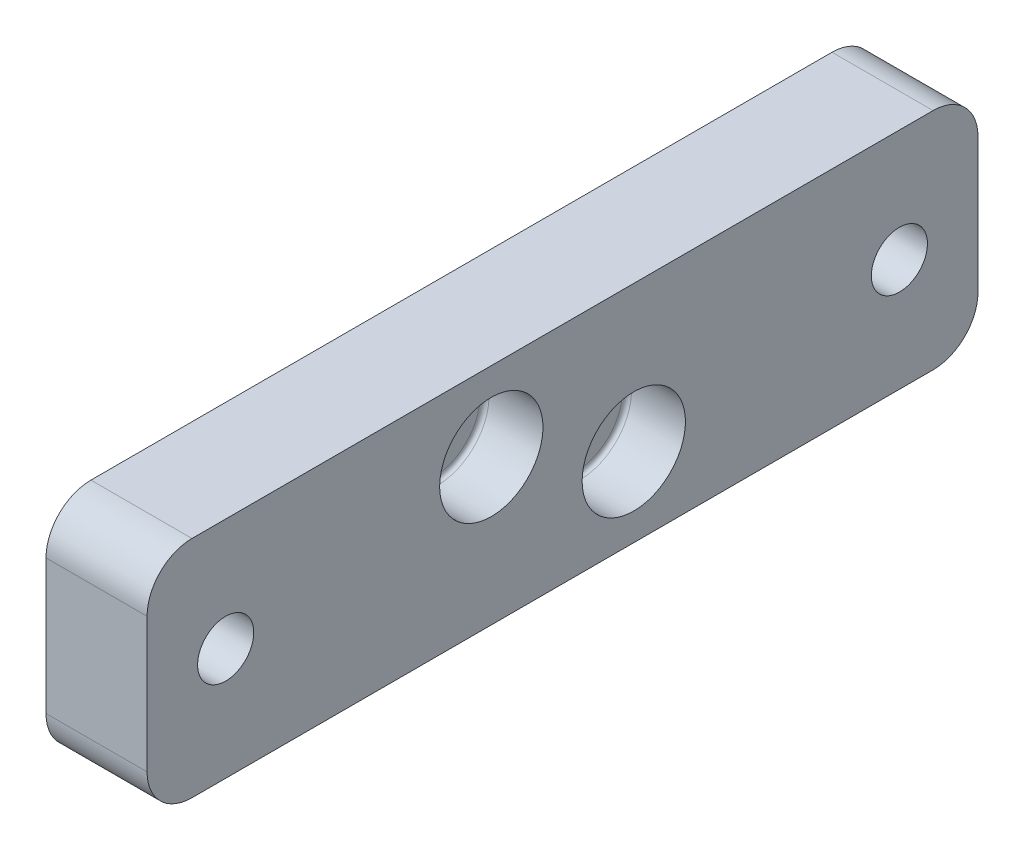
ISO-10303-21;
HEADER;
FILE_DESCRIPTION(('STEP AP214'),'2;1');
FILE_NAME('part.step','',(''),(''),'','','');
FILE_SCHEMA(('AUTOMOTIVE_DESIGN { 1 0 10303 214 1 1 1 1 }'));
ENDSEC;
DATA;
#1=APPLICATION_CONTEXT('core data for automotive mechanical design processes');
#2=APPLICATION_PROTOCOL_DEFINITION('international standard','automotive_design',2000,#1);
#3=PRODUCT_CONTEXT('',#1,'mechanical');
#4=PRODUCT('Part','Part','',(#3));
#5=PRODUCT_RELATED_PRODUCT_CATEGORY('part','',(#4));
#6=PRODUCT_DEFINITION_FORMATION('','',#4);
#7=PRODUCT_DEFINITION_CONTEXT('part definition',#1,'design');
#8=PRODUCT_DEFINITION('design','',#6,#7);
#9=PRODUCT_DEFINITION_SHAPE('','',#8);
#10=(LENGTH_UNIT() NAMED_UNIT(*) SI_UNIT(.MILLI.,.METRE.));
#11=(NAMED_UNIT(*) PLANE_ANGLE_UNIT() SI_UNIT($,.RADIAN.));
#12=(NAMED_UNIT(*) SI_UNIT($,.STERADIAN.) SOLID_ANGLE_UNIT());
#13=UNCERTAINTY_MEASURE_WITH_UNIT(LENGTH_MEASURE(1.E-05),#10,'distance_accuracy_value','');
#14=(GEOMETRIC_REPRESENTATION_CONTEXT(3) GLOBAL_UNCERTAINTY_ASSIGNED_CONTEXT((#13)) GLOBAL_UNIT_ASSIGNED_CONTEXT((#10,
#11,#12)) REPRESENTATION_CONTEXT('',''));
#15=CARTESIAN_POINT('',(0.,0.,0.));
#16=DIRECTION('',(0.,0.,1.));
#17=DIRECTION('',(1.,0.,0.));
#18=AXIS2_PLACEMENT_3D('',#15,#16,#17);
#19=CARTESIAN_POINT('',(5.715,-1.87853817343743,-4.0285381133779));
#20=DIRECTION('',(-1.,0.,0.));
#21=DIRECTION('',(0.,0.,-1.));
#22=AXIS2_PLACEMENT_3D('',#19,#20,#21);
#23=CYLINDRICAL_SURFACE('',#22,1.6129);
#24=CARTESIAN_POINT('',(0.,-1.87853817343743,-4.0285381133779));
#25=DIRECTION('',(-1.,0.,0.));
#26=DIRECTION('',(0.,0.,1.));
#27=AXIS2_PLACEMENT_3D('',#24,#25,#26);
#28=CIRCLE('',#27,1.6129);
#29=CARTESIAN_POINT('',(0.,-1.87853817343743,-2.4156381133779));
#30=VERTEX_POINT('',#29);
#31=EDGE_CURVE('E284',#30,#30,#28,.T.);
#32=ORIENTED_EDGE('',*,*,#31,.T.);
#33=EDGE_LOOP('',(#32));
#34=FACE_BOUND('',#33,.T.);
#35=CARTESIAN_POINT('',(2.413,-1.87853817343743,-4.0285381133779));
#36=DIRECTION('',(-1.,0.,0.));
#37=DIRECTION('',(0.,0.,1.));
#38=AXIS2_PLACEMENT_3D('',#35,#36,#37);
#39=CIRCLE('',#38,1.6129);
#40=CARTESIAN_POINT('',(2.413,-1.87853817343743,-2.4156381133779));
#41=VERTEX_POINT('',#40);
#42=EDGE_CURVE('E149',#41,#41,#39,.T.);
#43=ORIENTED_EDGE('',*,*,#42,.F.);
#44=EDGE_LOOP('',(#43));
#45=FACE_BOUND('',#44,.T.);
#46=ADVANCED_FACE('F43',(#34,#45),#23,.F.);
#47=CARTESIAN_POINT('',(5.715,1.87853817343743,4.0285381133779));
#48=DIRECTION('',(-1.,0.,0.));
#49=DIRECTION('',(0.,0.,-1.));
#50=AXIS2_PLACEMENT_3D('',#47,#48,#49);
#51=CYLINDRICAL_SURFACE('',#50,1.6129);
#52=CARTESIAN_POINT('',(0.,1.87853817343743,4.0285381133779));
#53=DIRECTION('',(-1.,0.,0.));
#54=DIRECTION('',(0.,0.,1.));
#55=AXIS2_PLACEMENT_3D('',#52,#53,#54);
#56=CIRCLE('',#55,1.6129);
#57=CARTESIAN_POINT('',(0.,1.87853817343743,5.6414381133779));
#58=VERTEX_POINT('',#57);
#59=EDGE_CURVE('E153',#58,#58,#56,.T.);
#60=ORIENTED_EDGE('',*,*,#59,.T.);
#61=EDGE_LOOP('',(#60));
#62=FACE_BOUND('',#61,.T.);
#63=CARTESIAN_POINT('',(2.413,1.87853817343743,4.0285381133779));
#64=DIRECTION('',(-1.,0.,0.));
#65=DIRECTION('',(0.,0.,1.));
#66=AXIS2_PLACEMENT_3D('',#63,#64,#65);
#67=CIRCLE('',#66,1.6129);
#68=CARTESIAN_POINT('',(2.413,1.87853817343743,5.6414381133779));
#69=VERTEX_POINT('',#68);
#70=EDGE_CURVE('E146',#69,#69,#67,.T.);
#71=ORIENTED_EDGE('',*,*,#70,.F.);
#72=EDGE_LOOP('',(#71));
#73=FACE_BOUND('',#72,.T.);
#74=ADVANCED_FACE('F195',(#62,#73),#51,.F.);
#75=CARTESIAN_POINT('',(5.715,0.,0.));
#76=DIRECTION('',(-1.,0.,0.));
#77=DIRECTION('',(0.,0.,-1.));
#78=AXIS2_PLACEMENT_3D('',#75,#76,#77);
#79=PLANE('',#78);
#80=CARTESIAN_POINT('',(5.715,-1.87853817343743,-4.0285381133779));
#81=DIRECTION('',(-1.,0.,0.));
#82=DIRECTION('',(0.,0.,1.));
#83=AXIS2_PLACEMENT_3D('',#80,#81,#82);
#84=CIRCLE('',#83,2.921);
#85=CARTESIAN_POINT('',(5.715,-1.87853817343743,-1.1075381133779));
#86=VERTEX_POINT('',#85);
#87=EDGE_CURVE('E150',#86,#86,#84,.T.);
#88=ORIENTED_EDGE('',*,*,#87,.T.);
#89=EDGE_LOOP('',(#88));
#90=FACE_BOUND('',#89,.T.);
#91=CARTESIAN_POINT('',(5.715,1.87853817343743,4.0285381133779));
#92=DIRECTION('',(-1.,0.,0.));
#93=DIRECTION('',(0.,0.,1.));
#94=AXIS2_PLACEMENT_3D('',#91,#92,#93);
#95=CIRCLE('',#94,2.921);
#96=CARTESIAN_POINT('',(5.715,1.87853817343743,6.9495381133779));
#97=VERTEX_POINT('',#96);
#98=EDGE_CURVE('E277',#97,#97,#95,.T.);
#99=ORIENTED_EDGE('',*,*,#98,.T.);
#100=EDGE_LOOP('',(#99));
#101=FACE_BOUND('',#100,.T.);
#102=DIRECTION('',(0.,0.,1.));
#103=VECTOR('',#102,1.);
#104=CARTESIAN_POINT('',(5.715,-6.35,23.495));
#105=LINE('',#104,#103);
#106=CARTESIAN_POINT('',(5.715,-6.35,-20.955));
#107=VERTEX_POINT('',#106);
#108=CARTESIAN_POINT('',(5.715,-6.35,20.955));
#109=VERTEX_POINT('',#108);
#110=EDGE_CURVE('E301',#107,#109,#105,.T.);
#111=ORIENTED_EDGE('',*,*,#110,.F.);
#112=CARTESIAN_POINT('',(5.715,-3.81,-20.955));
#113=DIRECTION('',(1.,0.,0.));
#114=DIRECTION('',(0.,0.,-1.));
#115=AXIS2_PLACEMENT_3D('',#112,#113,#114);
#116=CIRCLE('',#115,2.54);
#117=CARTESIAN_POINT('',(5.715,-3.81,-23.495));
#118=VERTEX_POINT('',#117);
#119=EDGE_CURVE('E166',#118,#107,#116,.F.);
#120=ORIENTED_EDGE('',*,*,#119,.F.);
#121=DIRECTION('',(0.,-1.,0.));
#122=VECTOR('',#121,1.);
#123=CARTESIAN_POINT('',(5.715,6.35,-23.495));
#124=LINE('',#123,#122);
#125=CARTESIAN_POINT('',(5.715,3.81,-23.495));
#126=VERTEX_POINT('',#125);
#127=EDGE_CURVE('E140',#126,#118,#124,.T.);
#128=ORIENTED_EDGE('',*,*,#127,.F.);
#129=CARTESIAN_POINT('',(5.715,3.81,-20.955));
#130=DIRECTION('',(1.,0.,0.));
#131=DIRECTION('',(0.,0.,-1.));
#132=AXIS2_PLACEMENT_3D('',#129,#130,#131);
#133=CIRCLE('',#132,2.54);
#134=CARTESIAN_POINT('',(5.715,6.35,-20.955));
#135=VERTEX_POINT('',#134);
#136=EDGE_CURVE('E164',#135,#126,#133,.F.);
#137=ORIENTED_EDGE('',*,*,#136,.F.);
#138=DIRECTION('',(0.,0.,-1.));
#139=VECTOR('',#138,1.);
#140=CARTESIAN_POINT('',(5.715,6.35,23.495));
#141=LINE('',#140,#139);
#142=CARTESIAN_POINT('',(5.715,6.35,20.955));
#143=VERTEX_POINT('',#142);
#144=EDGE_CURVE('E154',#143,#135,#141,.T.);
#145=ORIENTED_EDGE('',*,*,#144,.F.);
#146=CARTESIAN_POINT('',(5.715,3.81,20.955));
#147=DIRECTION('',(1.,0.,0.));
#148=DIRECTION('',(0.,0.,-1.));
#149=AXIS2_PLACEMENT_3D('',#146,#147,#148);
#150=CIRCLE('',#149,2.54);
#151=CARTESIAN_POINT('',(5.715,3.81,23.495));
#152=VERTEX_POINT('',#151);
#153=EDGE_CURVE('E169',#152,#143,#150,.F.);
#154=ORIENTED_EDGE('',*,*,#153,.F.);
#155=DIRECTION('',(0.,1.,0.));
#156=VECTOR('',#155,1.);
#157=CARTESIAN_POINT('',(5.715,6.35,23.495));
#158=LINE('',#157,#156);
#159=CARTESIAN_POINT('',(5.715,-3.81,23.495));
#160=VERTEX_POINT('',#159);
#161=EDGE_CURVE('E304',#160,#152,#158,.T.);
#162=ORIENTED_EDGE('',*,*,#161,.F.);
#163=CARTESIAN_POINT('',(5.715,-3.81,20.955));
#164=DIRECTION('',(1.,0.,0.));
#165=DIRECTION('',(0.,0.,-1.));
#166=AXIS2_PLACEMENT_3D('',#163,#164,#165);
#167=CIRCLE('',#166,2.54);
#168=EDGE_CURVE('E115',#109,#160,#167,.F.);
#169=ORIENTED_EDGE('',*,*,#168,.F.);
#170=EDGE_LOOP('',(#111,#120,#128,#137,#145,#154,#162,#169));
#171=FACE_BOUND('',#170,.T.);
#172=CARTESIAN_POINT('',(5.715,0.,-19.05));
#173=DIRECTION('',(-1.,0.,0.));
#174=DIRECTION('',(0.,0.,1.));
#175=AXIS2_PLACEMENT_3D('',#172,#173,#174);
#176=CIRCLE('',#175,1.5875);
#177=CARTESIAN_POINT('',(5.715,0.,-17.4625));
#178=VERTEX_POINT('',#177);
#179=EDGE_CURVE('E294',#178,#178,#176,.T.);
#180=ORIENTED_EDGE('',*,*,#179,.T.);
#181=EDGE_LOOP('',(#180));
#182=FACE_BOUND('',#181,.T.);
#183=CARTESIAN_POINT('',(5.715,0.,19.05));
#184=DIRECTION('',(-1.,0.,0.));
#185=DIRECTION('',(0.,0.,-1.));
#186=AXIS2_PLACEMENT_3D('',#183,#184,#185);
#187=CIRCLE('',#186,1.5875);
#188=CARTESIAN_POINT('',(5.715,0.,17.4625));
#189=VERTEX_POINT('',#188);
#190=EDGE_CURVE('E288',#189,#189,#187,.T.);
#191=ORIENTED_EDGE('',*,*,#190,.T.);
#192=EDGE_LOOP('',(#191));
#193=FACE_BOUND('',#192,.T.);
#194=ADVANCED_FACE('F197',(#90,#101,#171,#182,#193),#79,.F.);
#195=CARTESIAN_POINT('',(0.,0.,0.));
#196=DIRECTION('',(-1.,0.,0.));
#197=DIRECTION('',(0.,0.,-1.));
#198=AXIS2_PLACEMENT_3D('',#195,#196,#197);
#199=PLANE('',#198);
#200=ORIENTED_EDGE('',*,*,#31,.F.);
#201=EDGE_LOOP('',(#200));
#202=FACE_BOUND('',#201,.T.);
#203=CARTESIAN_POINT('',(0.,0.,-19.05));
#204=DIRECTION('',(-1.,0.,0.));
#205=DIRECTION('',(0.,0.,1.));
#206=AXIS2_PLACEMENT_3D('',#203,#204,#205);
#207=CIRCLE('',#206,1.5875);
#208=CARTESIAN_POINT('',(0.,0.,-17.4625));
#209=VERTEX_POINT('',#208);
#210=EDGE_CURVE('E291',#209,#209,#207,.T.);
#211=ORIENTED_EDGE('',*,*,#210,.F.);
#212=EDGE_LOOP('',(#211));
#213=FACE_BOUND('',#212,.T.);
#214=DIRECTION('',(0.,1.,0.));
#215=VECTOR('',#214,1.);
#216=CARTESIAN_POINT('',(0.,6.35,23.495));
#217=LINE('',#216,#215);
#218=CARTESIAN_POINT('',(0.,-3.81,23.495));
#219=VERTEX_POINT('',#218);
#220=CARTESIAN_POINT('',(0.,3.81,23.495));
#221=VERTEX_POINT('',#220);
#222=EDGE_CURVE('E128',#219,#221,#217,.T.);
#223=ORIENTED_EDGE('',*,*,#222,.T.);
#224=CARTESIAN_POINT('',(0.,3.81,20.955));
#225=DIRECTION('',(1.,0.,0.));
#226=DIRECTION('',(0.,0.,-1.));
#227=AXIS2_PLACEMENT_3D('',#224,#225,#226);
#228=CIRCLE('',#227,2.54);
#229=CARTESIAN_POINT('',(0.,6.35,20.955));
#230=VERTEX_POINT('',#229);
#231=EDGE_CURVE('E133',#230,#221,#228,.T.);
#232=ORIENTED_EDGE('',*,*,#231,.F.);
#233=DIRECTION('',(0.,0.,-1.));
#234=VECTOR('',#233,1.);
#235=CARTESIAN_POINT('',(0.,6.35,23.495));
#236=LINE('',#235,#234);
#237=CARTESIAN_POINT('',(0.,6.35,-20.955));
#238=VERTEX_POINT('',#237);
#239=EDGE_CURVE('E137',#230,#238,#236,.T.);
#240=ORIENTED_EDGE('',*,*,#239,.T.);
#241=CARTESIAN_POINT('',(0.,3.81,-20.955));
#242=DIRECTION('',(1.,0.,0.));
#243=DIRECTION('',(0.,0.,-1.));
#244=AXIS2_PLACEMENT_3D('',#241,#242,#243);
#245=CIRCLE('',#244,2.54);
#246=CARTESIAN_POINT('',(0.,3.81,-23.495));
#247=VERTEX_POINT('',#246);
#248=EDGE_CURVE('E120',#247,#238,#245,.T.);
#249=ORIENTED_EDGE('',*,*,#248,.F.);
#250=DIRECTION('',(0.,-1.,0.));
#251=VECTOR('',#250,1.);
#252=CARTESIAN_POINT('',(0.,6.35,-23.495));
#253=LINE('',#252,#251);
#254=CARTESIAN_POINT('',(0.,-3.81,-23.495));
#255=VERTEX_POINT('',#254);
#256=EDGE_CURVE('E142',#247,#255,#253,.T.);
#257=ORIENTED_EDGE('',*,*,#256,.T.);
#258=CARTESIAN_POINT('',(0.,-3.81,-20.955));
#259=DIRECTION('',(1.,0.,0.));
#260=DIRECTION('',(0.,0.,-1.));
#261=AXIS2_PLACEMENT_3D('',#258,#259,#260);
#262=CIRCLE('',#261,2.54);
#263=CARTESIAN_POINT('',(0.,-6.35,-20.955));
#264=VERTEX_POINT('',#263);
#265=EDGE_CURVE('E157',#264,#255,#262,.T.);
#266=ORIENTED_EDGE('',*,*,#265,.F.);
#267=DIRECTION('',(0.,0.,1.));
#268=VECTOR('',#267,1.);
#269=CARTESIAN_POINT('',(0.,-6.35,23.495));
#270=LINE('',#269,#268);
#271=CARTESIAN_POINT('',(0.,-6.35,20.955));
#272=VERTEX_POINT('',#271);
#273=EDGE_CURVE('E131',#264,#272,#270,.T.);
#274=ORIENTED_EDGE('',*,*,#273,.T.);
#275=CARTESIAN_POINT('',(0.,-3.81,20.955));
#276=DIRECTION('',(1.,0.,0.));
#277=DIRECTION('',(0.,0.,-1.));
#278=AXIS2_PLACEMENT_3D('',#275,#276,#277);
#279=CIRCLE('',#278,2.54);
#280=EDGE_CURVE('E112',#219,#272,#279,.T.);
#281=ORIENTED_EDGE('',*,*,#280,.F.);
#282=EDGE_LOOP('',(#223,#232,#240,#249,#257,#266,#274,#281));
#283=FACE_BOUND('',#282,.T.);
#284=CARTESIAN_POINT('',(0.,0.,19.05));
#285=DIRECTION('',(-1.,0.,0.));
#286=DIRECTION('',(0.,0.,-1.));
#287=AXIS2_PLACEMENT_3D('',#284,#285,#286);
#288=CIRCLE('',#287,1.5875);
#289=CARTESIAN_POINT('',(0.,0.,17.4625));
#290=VERTEX_POINT('',#289);
#291=EDGE_CURVE('E287',#290,#290,#288,.T.);
#292=ORIENTED_EDGE('',*,*,#291,.F.);
#293=EDGE_LOOP('',(#292));
#294=FACE_BOUND('',#293,.T.);
#295=ORIENTED_EDGE('',*,*,#59,.F.);
#296=EDGE_LOOP('',(#295));
#297=FACE_BOUND('',#296,.T.);
#298=ADVANCED_FACE('F125',(#202,#213,#283,#294,#297),#199,.T.);
#299=CARTESIAN_POINT('',(5.715,6.35,-23.495));
#300=DIRECTION('',(0.,0.,1.));
#301=DIRECTION('',(-1.,0.,0.));
#302=AXIS2_PLACEMENT_3D('',#299,#300,#301);
#303=PLANE('',#302);
#304=ORIENTED_EDGE('',*,*,#256,.F.);
#305=DIRECTION('',(-1.,0.,0.));
#306=VECTOR('',#305,1.);
#307=CARTESIAN_POINT('',(5.715,3.81,-23.495));
#308=LINE('',#307,#306);
#309=EDGE_CURVE('E174',#126,#247,#308,.T.);
#310=ORIENTED_EDGE('',*,*,#309,.F.);
#311=ORIENTED_EDGE('',*,*,#127,.T.);
#312=DIRECTION('',(-1.,0.,0.));
#313=VECTOR('',#312,1.);
#314=CARTESIAN_POINT('',(5.715,-3.81,-23.495));
#315=LINE('',#314,#313);
#316=EDGE_CURVE('E176',#255,#118,#315,.F.);
#317=ORIENTED_EDGE('',*,*,#316,.F.);
#318=EDGE_LOOP('',(#304,#310,#311,#317));
#319=FACE_BOUND('',#318,.T.);
#320=ADVANCED_FACE('F222',(#319),#303,.F.);
#321=CARTESIAN_POINT('',(5.715,-6.35,23.495));
#322=DIRECTION('',(0.,1.,0.));
#323=DIRECTION('',(0.,0.,-1.));
#324=AXIS2_PLACEMENT_3D('',#321,#322,#323);
#325=PLANE('',#324);
#326=ORIENTED_EDGE('',*,*,#273,.F.);
#327=DIRECTION('',(-1.,0.,0.));
#328=VECTOR('',#327,1.);
#329=CARTESIAN_POINT('',(5.715,-6.35,-20.955));
#330=LINE('',#329,#328);
#331=EDGE_CURVE('E132',#107,#264,#330,.T.);
#332=ORIENTED_EDGE('',*,*,#331,.F.);
#333=ORIENTED_EDGE('',*,*,#110,.T.);
#334=DIRECTION('',(-1.,0.,0.));
#335=VECTOR('',#334,1.);
#336=CARTESIAN_POINT('',(5.715,-6.35,20.955));
#337=LINE('',#336,#335);
#338=EDGE_CURVE('E162',#272,#109,#337,.F.);
#339=ORIENTED_EDGE('',*,*,#338,.F.);
#340=EDGE_LOOP('',(#326,#332,#333,#339));
#341=FACE_BOUND('',#340,.T.);
#342=ADVANCED_FACE('F228',(#341),#325,.F.);
#343=CARTESIAN_POINT('',(5.715,6.35,23.495));
#344=DIRECTION('',(0.,0.,-1.));
#345=DIRECTION('',(1.,0.,0.));
#346=AXIS2_PLACEMENT_3D('',#343,#344,#345);
#347=PLANE('',#346);
#348=ORIENTED_EDGE('',*,*,#161,.T.);
#349=DIRECTION('',(-1.,0.,0.));
#350=VECTOR('',#349,1.);
#351=CARTESIAN_POINT('',(5.715,3.81,23.495));
#352=LINE('',#351,#350);
#353=EDGE_CURVE('E121',#221,#152,#352,.F.);
#354=ORIENTED_EDGE('',*,*,#353,.F.);
#355=ORIENTED_EDGE('',*,*,#222,.F.);
#356=DIRECTION('',(-1.,0.,0.));
#357=VECTOR('',#356,1.);
#358=CARTESIAN_POINT('',(5.715,-3.81,23.495));
#359=LINE('',#358,#357);
#360=EDGE_CURVE('E109',#160,#219,#359,.T.);
#361=ORIENTED_EDGE('',*,*,#360,.F.);
#362=EDGE_LOOP('',(#348,#354,#355,#361));
#363=FACE_BOUND('',#362,.T.);
#364=ADVANCED_FACE('F135',(#363),#347,.F.);
#365=CARTESIAN_POINT('',(5.715,6.35,23.495));
#366=DIRECTION('',(0.,-1.,0.));
#367=DIRECTION('',(0.,0.,1.));
#368=AXIS2_PLACEMENT_3D('',#365,#366,#367);
#369=PLANE('',#368);
#370=ORIENTED_EDGE('',*,*,#144,.T.);
#371=DIRECTION('',(-1.,0.,0.));
#372=VECTOR('',#371,1.);
#373=CARTESIAN_POINT('',(5.715,6.35,-20.955));
#374=LINE('',#373,#372);
#375=EDGE_CURVE('E58',#238,#135,#374,.F.);
#376=ORIENTED_EDGE('',*,*,#375,.F.);
#377=ORIENTED_EDGE('',*,*,#239,.F.);
#378=DIRECTION('',(-1.,0.,0.));
#379=VECTOR('',#378,1.);
#380=CARTESIAN_POINT('',(5.715,6.35,20.955));
#381=LINE('',#380,#379);
#382=EDGE_CURVE('E65',#143,#230,#381,.T.);
#383=ORIENTED_EDGE('',*,*,#382,.F.);
#384=EDGE_LOOP('',(#370,#376,#377,#383));
#385=FACE_BOUND('',#384,.T.);
#386=ADVANCED_FACE('F217',(#385),#369,.F.);
#387=CARTESIAN_POINT('',(5.715,0.,-19.05));
#388=DIRECTION('',(-1.,0.,0.));
#389=DIRECTION('',(0.,0.,-1.));
#390=AXIS2_PLACEMENT_3D('',#387,#388,#389);
#391=CYLINDRICAL_SURFACE('',#390,1.5875);
#392=ORIENTED_EDGE('',*,*,#179,.F.);
#393=EDGE_LOOP('',(#392));
#394=FACE_BOUND('',#393,.T.);
#395=ORIENTED_EDGE('',*,*,#210,.T.);
#396=EDGE_LOOP('',(#395));
#397=FACE_BOUND('',#396,.T.);
#398=ADVANCED_FACE('F214',(#394,#397),#391,.F.);
#399=CARTESIAN_POINT('',(5.715,0.,19.05));
#400=DIRECTION('',(-1.,0.,0.));
#401=DIRECTION('',(0.,0.,-1.));
#402=AXIS2_PLACEMENT_3D('',#399,#400,#401);
#403=CYLINDRICAL_SURFACE('',#402,1.5875);
#404=ORIENTED_EDGE('',*,*,#190,.F.);
#405=EDGE_LOOP('',(#404));
#406=FACE_BOUND('',#405,.T.);
#407=ORIENTED_EDGE('',*,*,#291,.T.);
#408=EDGE_LOOP('',(#407));
#409=FACE_BOUND('',#408,.T.);
#410=ADVANCED_FACE('F211',(#406,#409),#403,.F.);
#411=CARTESIAN_POINT('',(2.413,1.87853817343743,4.0285381133779));
#412=DIRECTION('',(1.,0.,0.));
#413=DIRECTION('',(0.,0.,1.));
#414=AXIS2_PLACEMENT_3D('',#411,#412,#413);
#415=CYLINDRICAL_SURFACE('',#414,2.921);
#416=CARTESIAN_POINT('',(2.667,1.87853817343743,4.0285381133779));
#417=DIRECTION('',(-1.,0.,0.));
#418=DIRECTION('',(0.,0.,1.));
#419=AXIS2_PLACEMENT_3D('',#416,#417,#418);
#420=CIRCLE('',#419,2.921);
#421=CARTESIAN_POINT('',(2.667,1.87853817343743,6.9495381133779));
#422=VERTEX_POINT('',#421);
#423=EDGE_CURVE('E11',#422,#422,#420,.F.);
#424=CARTESIAN_POINT('',(2.667,1.87853817343743,6.9495381133779));
#425=CARTESIAN_POINT('',(2.69875,1.87853817343743,6.9495381133779));
#426=CARTESIAN_POINT('',(2.7305,1.87853817343743,6.9495381133779));
#427=CARTESIAN_POINT('',(2.794,1.87853817343743,6.9495381133779));
#428=CARTESIAN_POINT('',(2.82575,1.87853817343743,6.9495381133779));
#429=CARTESIAN_POINT('',(2.88925,1.87853817343743,6.9495381133779));
#430=CARTESIAN_POINT('',(2.921,1.87853817343743,6.9495381133779));
#431=CARTESIAN_POINT('',(2.9845,1.87853817343743,6.9495381133779));
#432=CARTESIAN_POINT('',(3.01625,1.87853817343743,6.9495381133779));
#433=CARTESIAN_POINT('',(3.07975,1.87853817343743,6.9495381133779));
#434=CARTESIAN_POINT('',(3.1115,1.87853817343743,6.9495381133779));
#435=CARTESIAN_POINT('',(3.175,1.87853817343743,6.9495381133779));
#436=CARTESIAN_POINT('',(3.20675,1.87853817343743,6.9495381133779));
#437=CARTESIAN_POINT('',(3.27025,1.87853817343743,6.9495381133779));
#438=CARTESIAN_POINT('',(3.302,1.87853817343743,6.9495381133779));
#439=CARTESIAN_POINT('',(3.3655,1.87853817343743,6.9495381133779));
#440=CARTESIAN_POINT('',(3.39725,1.87853817343743,6.9495381133779));
#441=CARTESIAN_POINT('',(3.46075,1.87853817343743,6.9495381133779));
#442=CARTESIAN_POINT('',(3.4925,1.87853817343743,6.9495381133779));
#443=CARTESIAN_POINT('',(3.556,1.87853817343743,6.9495381133779));
#444=CARTESIAN_POINT('',(3.58775,1.87853817343743,6.9495381133779));
#445=CARTESIAN_POINT('',(3.65125,1.87853817343743,6.9495381133779));
#446=CARTESIAN_POINT('',(3.683,1.87853817343743,6.9495381133779));
#447=CARTESIAN_POINT('',(3.7465,1.87853817343743,6.9495381133779));
#448=CARTESIAN_POINT('',(3.77825,1.87853817343743,6.9495381133779));
#449=CARTESIAN_POINT('',(3.84175,1.87853817343743,6.9495381133779));
#450=CARTESIAN_POINT('',(3.8735,1.87853817343743,6.9495381133779));
#451=CARTESIAN_POINT('',(3.937,1.87853817343743,6.9495381133779));
#452=CARTESIAN_POINT('',(3.96875,1.87853817343743,6.9495381133779));
#453=CARTESIAN_POINT('',(4.03225,1.87853817343743,6.9495381133779));
#454=CARTESIAN_POINT('',(4.064,1.87853817343743,6.9495381133779));
#455=CARTESIAN_POINT('',(4.1275,1.87853817343743,6.9495381133779));
#456=CARTESIAN_POINT('',(4.15925,1.87853817343743,6.9495381133779));
#457=CARTESIAN_POINT('',(4.22275,1.87853817343743,6.9495381133779));
#458=CARTESIAN_POINT('',(4.2545,1.87853817343743,6.9495381133779));
#459=CARTESIAN_POINT('',(4.318,1.87853817343743,6.9495381133779));
#460=CARTESIAN_POINT('',(4.34975,1.87853817343743,6.9495381133779));
#461=CARTESIAN_POINT('',(4.41325,1.87853817343743,6.9495381133779));
#462=CARTESIAN_POINT('',(4.445,1.87853817343743,6.9495381133779));
#463=CARTESIAN_POINT('',(4.5085,1.87853817343743,6.9495381133779));
#464=CARTESIAN_POINT('',(4.54025,1.87853817343743,6.9495381133779));
#465=CARTESIAN_POINT('',(4.60375,1.87853817343743,6.9495381133779));
#466=CARTESIAN_POINT('',(4.6355,1.87853817343743,6.9495381133779));
#467=CARTESIAN_POINT('',(4.699,1.87853817343743,6.9495381133779));
#468=CARTESIAN_POINT('',(4.73075,1.87853817343743,6.9495381133779));
#469=CARTESIAN_POINT('',(4.79425,1.87853817343743,6.9495381133779));
#470=CARTESIAN_POINT('',(4.826,1.87853817343743,6.9495381133779));
#471=CARTESIAN_POINT('',(4.8895,1.87853817343743,6.9495381133779));
#472=CARTESIAN_POINT('',(4.92125,1.87853817343743,6.9495381133779));
#473=CARTESIAN_POINT('',(4.98475,1.87853817343743,6.9495381133779));
#474=CARTESIAN_POINT('',(5.0165,1.87853817343743,6.9495381133779));
#475=CARTESIAN_POINT('',(5.08,1.87853817343743,6.9495381133779));
#476=CARTESIAN_POINT('',(5.11175,1.87853817343743,6.9495381133779));
#477=CARTESIAN_POINT('',(5.17525,1.87853817343743,6.9495381133779));
#478=CARTESIAN_POINT('',(5.207,1.87853817343743,6.9495381133779));
#479=CARTESIAN_POINT('',(5.2705,1.87853817343743,6.9495381133779));
#480=CARTESIAN_POINT('',(5.30225,1.87853817343743,6.9495381133779));
#481=CARTESIAN_POINT('',(5.36575,1.87853817343743,6.9495381133779));
#482=CARTESIAN_POINT('',(5.3975,1.87853817343743,6.9495381133779));
#483=CARTESIAN_POINT('',(5.461,1.87853817343743,6.9495381133779));
#484=CARTESIAN_POINT('',(5.49275,1.87853817343743,6.9495381133779));
#485=CARTESIAN_POINT('',(5.55625,1.87853817343743,6.9495381133779));
#486=CARTESIAN_POINT('',(5.588,1.87853817343743,6.9495381133779));
#487=CARTESIAN_POINT('',(5.6515,1.87853817343743,6.9495381133779));
#488=CARTESIAN_POINT('',(5.68325,1.87853817343743,6.9495381133779));
#489=CARTESIAN_POINT('',(5.715,1.87853817343743,6.9495381133779));
#490=B_SPLINE_CURVE_WITH_KNOTS('',3,(#424,#425,#426,#427,#428,#429,#430,#431,#432,#433,#434,
#435,#436,#437,#438,#439,#440,#441,#442,#443,#444,#445,#446,#447,#448,#449,#450,#451,#452,#453,
#454,#455,#456,#457,#458,#459,#460,#461,#462,#463,#464,#465,#466,#467,#468,#469,#470,#471,#472,
#473,#474,#475,#476,#477,#478,#479,#480,#481,#482,#483,#484,#485,#486,#487,#488,#489),
.UNSPECIFIED.,.F.,.F.,(4,2,2,2,2,2,2,2,2,2,2,2,2,2,2,2,2,2,2,2,2,2,2,2,2,2,2,2,2,2,2,2,4),(0.,
0.0952500000000003,0.1905,0.28575,0.381,0.476250000000001,0.5715,0.66675,0.762,0.85725,
0.952500000000001,1.04775,1.143,1.23825,1.3335,1.42875,1.524,1.61925,1.7145,1.80975,1.905,
2.00025,2.0955,2.19075,2.286,2.38125,2.4765,2.57175,2.667,2.76225,2.8575,2.95275,3.048),.UNSPECIFIED.);
#491=EDGE_CURVE('BSEAM191',#422,#97,#490,.T.);
#492=ORIENTED_EDGE('',*,*,#423,.F.);
#493=ORIENTED_EDGE('',*,*,#98,.F.);
#494=ORIENTED_EDGE('',*,*,#491,.T.);
#495=ORIENTED_EDGE('',*,*,#491,.F.);
#496=EDGE_LOOP('',(#492,#494,#493,#495));
#497=FACE_BOUND('',#496,.T.);
#498=ADVANCED_FACE('F191',(#497),#415,.F.);
#499=CARTESIAN_POINT('',(2.413,1.87853817343743,4.0285381133779));
#500=DIRECTION('',(1.,0.,0.));
#501=DIRECTION('',(0.,0.,1.));
#502=AXIS2_PLACEMENT_3D('',#499,#500,#501);
#503=PLANE('',#502);
#504=CARTESIAN_POINT('',(2.413,1.87853817343743,4.0285381133779));
#505=DIRECTION('',(-1.,0.,0.));
#506=DIRECTION('',(0.,0.,1.));
#507=AXIS2_PLACEMENT_3D('',#504,#505,#506);
#508=CIRCLE('',#507,2.667);
#509=CARTESIAN_POINT('',(2.413,1.87853817343743,6.6955381133779));
#510=VERTEX_POINT('',#509);
#511=EDGE_CURVE('E51',#510,#510,#508,.T.);
#512=ORIENTED_EDGE('',*,*,#511,.F.);
#513=EDGE_LOOP('',(#512));
#514=FACE_BOUND('',#513,.T.);
#515=ORIENTED_EDGE('',*,*,#70,.T.);
#516=EDGE_LOOP('',(#515));
#517=FACE_BOUND('',#516,.T.);
#518=ADVANCED_FACE('F187',(#514,#517),#503,.T.);
#519=CARTESIAN_POINT('',(2.413,-1.87853817343743,-4.0285381133779));
#520=DIRECTION('',(1.,0.,0.));
#521=DIRECTION('',(0.,0.,1.));
#522=AXIS2_PLACEMENT_3D('',#519,#520,#521);
#523=CYLINDRICAL_SURFACE('',#522,2.921);
#524=CARTESIAN_POINT('',(2.667,-1.87853817343743,-4.0285381133779));
#525=DIRECTION('',(-1.,0.,0.));
#526=DIRECTION('',(0.,0.,1.));
#527=AXIS2_PLACEMENT_3D('',#524,#525,#526);
#528=CIRCLE('',#527,2.921);
#529=CARTESIAN_POINT('',(2.667,-1.87853817343743,-1.1075381133779));
#530=VERTEX_POINT('',#529);
#531=EDGE_CURVE('E181',#530,#530,#528,.F.);
#532=CARTESIAN_POINT('',(2.667,-1.87853817343743,-1.1075381133779));
#533=CARTESIAN_POINT('',(2.69875,-1.87853817343743,-1.1075381133779));
#534=CARTESIAN_POINT('',(2.7305,-1.87853817343743,-1.1075381133779));
#535=CARTESIAN_POINT('',(2.794,-1.87853817343743,-1.1075381133779));
#536=CARTESIAN_POINT('',(2.82575,-1.87853817343743,-1.1075381133779));
#537=CARTESIAN_POINT('',(2.88925,-1.87853817343743,-1.1075381133779));
#538=CARTESIAN_POINT('',(2.921,-1.87853817343743,-1.1075381133779));
#539=CARTESIAN_POINT('',(2.9845,-1.87853817343743,-1.1075381133779));
#540=CARTESIAN_POINT('',(3.01625,-1.87853817343743,-1.1075381133779));
#541=CARTESIAN_POINT('',(3.07975,-1.87853817343743,-1.1075381133779));
#542=CARTESIAN_POINT('',(3.1115,-1.87853817343743,-1.1075381133779));
#543=CARTESIAN_POINT('',(3.175,-1.87853817343743,-1.1075381133779));
#544=CARTESIAN_POINT('',(3.20675,-1.87853817343743,-1.1075381133779));
#545=CARTESIAN_POINT('',(3.27025,-1.87853817343743,-1.1075381133779));
#546=CARTESIAN_POINT('',(3.302,-1.87853817343743,-1.1075381133779));
#547=CARTESIAN_POINT('',(3.3655,-1.87853817343743,-1.1075381133779));
#548=CARTESIAN_POINT('',(3.39725,-1.87853817343743,-1.1075381133779));
#549=CARTESIAN_POINT('',(3.46075,-1.87853817343743,-1.1075381133779));
#550=CARTESIAN_POINT('',(3.4925,-1.87853817343743,-1.1075381133779));
#551=CARTESIAN_POINT('',(3.556,-1.87853817343743,-1.1075381133779));
#552=CARTESIAN_POINT('',(3.58775,-1.87853817343743,-1.1075381133779));
#553=CARTESIAN_POINT('',(3.65125,-1.87853817343743,-1.1075381133779));
#554=CARTESIAN_POINT('',(3.683,-1.87853817343743,-1.1075381133779));
#555=CARTESIAN_POINT('',(3.7465,-1.87853817343743,-1.1075381133779));
#556=CARTESIAN_POINT('',(3.77825,-1.87853817343743,-1.1075381133779));
#557=CARTESIAN_POINT('',(3.84175,-1.87853817343743,-1.1075381133779));
#558=CARTESIAN_POINT('',(3.8735,-1.87853817343743,-1.1075381133779));
#559=CARTESIAN_POINT('',(3.937,-1.87853817343743,-1.1075381133779));
#560=CARTESIAN_POINT('',(3.96875,-1.87853817343743,-1.1075381133779));
#561=CARTESIAN_POINT('',(4.03225,-1.87853817343743,-1.1075381133779));
#562=CARTESIAN_POINT('',(4.064,-1.87853817343743,-1.1075381133779));
#563=CARTESIAN_POINT('',(4.1275,-1.87853817343743,-1.1075381133779));
#564=CARTESIAN_POINT('',(4.15925,-1.87853817343743,-1.1075381133779));
#565=CARTESIAN_POINT('',(4.22275,-1.87853817343743,-1.1075381133779));
#566=CARTESIAN_POINT('',(4.2545,-1.87853817343743,-1.1075381133779));
#567=CARTESIAN_POINT('',(4.318,-1.87853817343743,-1.1075381133779));
#568=CARTESIAN_POINT('',(4.34975,-1.87853817343743,-1.1075381133779));
#569=CARTESIAN_POINT('',(4.41325,-1.87853817343743,-1.1075381133779));
#570=CARTESIAN_POINT('',(4.445,-1.87853817343743,-1.1075381133779));
#571=CARTESIAN_POINT('',(4.5085,-1.87853817343743,-1.1075381133779));
#572=CARTESIAN_POINT('',(4.54025,-1.87853817343743,-1.1075381133779));
#573=CARTESIAN_POINT('',(4.60375,-1.87853817343743,-1.1075381133779));
#574=CARTESIAN_POINT('',(4.6355,-1.87853817343743,-1.1075381133779));
#575=CARTESIAN_POINT('',(4.699,-1.87853817343743,-1.1075381133779));
#576=CARTESIAN_POINT('',(4.73075,-1.87853817343743,-1.1075381133779));
#577=CARTESIAN_POINT('',(4.79425,-1.87853817343743,-1.1075381133779));
#578=CARTESIAN_POINT('',(4.826,-1.87853817343743,-1.1075381133779));
#579=CARTESIAN_POINT('',(4.8895,-1.87853817343743,-1.1075381133779));
#580=CARTESIAN_POINT('',(4.92125,-1.87853817343743,-1.1075381133779));
#581=CARTESIAN_POINT('',(4.98475,-1.87853817343743,-1.1075381133779));
#582=CARTESIAN_POINT('',(5.0165,-1.87853817343743,-1.1075381133779));
#583=CARTESIAN_POINT('',(5.08,-1.87853817343743,-1.1075381133779));
#584=CARTESIAN_POINT('',(5.11175,-1.87853817343743,-1.1075381133779));
#585=CARTESIAN_POINT('',(5.17525,-1.87853817343743,-1.1075381133779));
#586=CARTESIAN_POINT('',(5.207,-1.87853817343743,-1.1075381133779));
#587=CARTESIAN_POINT('',(5.2705,-1.87853817343743,-1.1075381133779));
#588=CARTESIAN_POINT('',(5.30225,-1.87853817343743,-1.1075381133779));
#589=CARTESIAN_POINT('',(5.36575,-1.87853817343743,-1.1075381133779));
#590=CARTESIAN_POINT('',(5.3975,-1.87853817343743,-1.1075381133779));
#591=CARTESIAN_POINT('',(5.461,-1.87853817343743,-1.1075381133779));
#592=CARTESIAN_POINT('',(5.49275,-1.87853817343743,-1.1075381133779));
#593=CARTESIAN_POINT('',(5.55625,-1.87853817343743,-1.1075381133779));
#594=CARTESIAN_POINT('',(5.588,-1.87853817343743,-1.1075381133779));
#595=CARTESIAN_POINT('',(5.6515,-1.87853817343743,-1.1075381133779));
#596=CARTESIAN_POINT('',(5.68325,-1.87853817343743,-1.1075381133779));
#597=CARTESIAN_POINT('',(5.715,-1.87853817343743,-1.1075381133779));
#598=B_SPLINE_CURVE_WITH_KNOTS('',3,(#532,#533,#534,#535,#536,#537,#538,#539,#540,#541,#542,
#543,#544,#545,#546,#547,#548,#549,#550,#551,#552,#553,#554,#555,#556,#557,#558,#559,#560,#561,
#562,#563,#564,#565,#566,#567,#568,#569,#570,#571,#572,#573,#574,#575,#576,#577,#578,#579,#580,
#581,#582,#583,#584,#585,#586,#587,#588,#589,#590,#591,#592,#593,#594,#595,#596,#597),
.UNSPECIFIED.,.F.,.F.,(4,2,2,2,2,2,2,2,2,2,2,2,2,2,2,2,2,2,2,2,2,2,2,2,2,2,2,2,2,2,2,2,4),(0.,
0.0952500000000003,0.1905,0.28575,0.381,0.476250000000001,0.5715,0.66675,0.762,0.85725,
0.952500000000001,1.04775,1.143,1.23825,1.3335,1.42875,1.524,1.61925,1.7145,1.80975,1.905,
2.00025,2.0955,2.19075,2.286,2.38125,2.4765,2.57175,2.667,2.76225,2.8575,2.95275,3.048),.UNSPECIFIED.);
#599=EDGE_CURVE('BSEAM190',#530,#86,#598,.T.);
#600=ORIENTED_EDGE('',*,*,#531,.F.);
#601=ORIENTED_EDGE('',*,*,#87,.F.);
#602=ORIENTED_EDGE('',*,*,#599,.T.);
#603=ORIENTED_EDGE('',*,*,#599,.F.);
#604=EDGE_LOOP('',(#600,#602,#601,#603));
#605=FACE_BOUND('',#604,.T.);
#606=ADVANCED_FACE('F190',(#605),#523,.F.);
#607=CARTESIAN_POINT('',(2.413,-1.87853817343743,-4.0285381133779));
#608=DIRECTION('',(1.,0.,0.));
#609=DIRECTION('',(0.,0.,1.));
#610=AXIS2_PLACEMENT_3D('',#607,#608,#609);
#611=PLANE('',#610);
#612=CARTESIAN_POINT('',(2.413,-1.87853817343743,-4.0285381133779));
#613=DIRECTION('',(-1.,0.,0.));
#614=DIRECTION('',(0.,0.,1.));
#615=AXIS2_PLACEMENT_3D('',#612,#613,#614);
#616=CIRCLE('',#615,2.667);
#617=CARTESIAN_POINT('',(2.413,-1.87853817343743,-1.3615381133779));
#618=VERTEX_POINT('',#617);
#619=EDGE_CURVE('E178',#618,#618,#616,.T.);
#620=ORIENTED_EDGE('',*,*,#619,.F.);
#621=EDGE_LOOP('',(#620));
#622=FACE_BOUND('',#621,.T.);
#623=ORIENTED_EDGE('',*,*,#42,.T.);
#624=EDGE_LOOP('',(#623));
#625=FACE_BOUND('',#624,.T.);
#626=ADVANCED_FACE('F238',(#622,#625),#611,.T.);
#627=CARTESIAN_POINT('',(5.715,-3.81,20.955));
#628=DIRECTION('',(-1.,0.,0.));
#629=DIRECTION('',(0.,0.,-1.));
#630=AXIS2_PLACEMENT_3D('',#627,#628,#629);
#631=CYLINDRICAL_SURFACE('',#630,2.54);
#632=ORIENTED_EDGE('',*,*,#168,.T.);
#633=ORIENTED_EDGE('',*,*,#360,.T.);
#634=ORIENTED_EDGE('',*,*,#280,.T.);
#635=ORIENTED_EDGE('',*,*,#338,.T.);
#636=EDGE_LOOP('',(#632,#633,#634,#635));
#637=FACE_BOUND('',#636,.T.);
#638=ADVANCED_FACE('F111',(#637),#631,.T.);
#639=CARTESIAN_POINT('',(5.715,3.81,20.955));
#640=DIRECTION('',(-1.,0.,0.));
#641=DIRECTION('',(0.,0.,-1.));
#642=AXIS2_PLACEMENT_3D('',#639,#640,#641);
#643=CYLINDRICAL_SURFACE('',#642,2.54);
#644=ORIENTED_EDGE('',*,*,#153,.T.);
#645=ORIENTED_EDGE('',*,*,#382,.T.);
#646=ORIENTED_EDGE('',*,*,#231,.T.);
#647=ORIENTED_EDGE('',*,*,#353,.T.);
#648=EDGE_LOOP('',(#644,#645,#646,#647));
#649=FACE_BOUND('',#648,.T.);
#650=ADVANCED_FACE('F237',(#649),#643,.T.);
#651=CARTESIAN_POINT('',(5.715,-3.81,-20.955));
#652=DIRECTION('',(-1.,0.,0.));
#653=DIRECTION('',(0.,0.,-1.));
#654=AXIS2_PLACEMENT_3D('',#651,#652,#653);
#655=CYLINDRICAL_SURFACE('',#654,2.54);
#656=ORIENTED_EDGE('',*,*,#119,.T.);
#657=ORIENTED_EDGE('',*,*,#331,.T.);
#658=ORIENTED_EDGE('',*,*,#265,.T.);
#659=ORIENTED_EDGE('',*,*,#316,.T.);
#660=EDGE_LOOP('',(#656,#657,#658,#659));
#661=FACE_BOUND('',#660,.T.);
#662=ADVANCED_FACE('F241',(#661),#655,.T.);
#663=CARTESIAN_POINT('',(5.715,3.81,-20.955));
#664=DIRECTION('',(-1.,0.,0.));
#665=DIRECTION('',(0.,0.,-1.));
#666=AXIS2_PLACEMENT_3D('',#663,#664,#665);
#667=CYLINDRICAL_SURFACE('',#666,2.54);
#668=ORIENTED_EDGE('',*,*,#136,.T.);
#669=ORIENTED_EDGE('',*,*,#309,.T.);
#670=ORIENTED_EDGE('',*,*,#248,.T.);
#671=ORIENTED_EDGE('',*,*,#375,.T.);
#672=EDGE_LOOP('',(#668,#669,#670,#671));
#673=FACE_BOUND('',#672,.T.);
#674=ADVANCED_FACE('F245',(#673),#667,.T.);
#675=CARTESIAN_POINT('',(2.667,-1.87853817343743,-4.0285381133779));
#676=DIRECTION('',(1.,0.,0.));
#677=DIRECTION('',(0.,0.,1.));
#678=AXIS2_PLACEMENT_3D('',#675,#676,#677);
#679=TOROIDAL_SURFACE('',#678,2.667,0.254);
#680=ORIENTED_EDGE('',*,*,#531,.T.);
#681=EDGE_LOOP('',(#680));
#682=FACE_BOUND('',#681,.T.);
#683=ORIENTED_EDGE('',*,*,#619,.T.);
#684=EDGE_LOOP('',(#683));
#685=FACE_BOUND('',#684,.T.);
#686=ADVANCED_FACE('F248',(#682,#685),#679,.F.);
#687=CARTESIAN_POINT('',(2.667,1.87853817343743,4.0285381133779));
#688=DIRECTION('',(1.,0.,0.));
#689=DIRECTION('',(0.,0.,1.));
#690=AXIS2_PLACEMENT_3D('',#687,#688,#689);
#691=TOROIDAL_SURFACE('',#690,2.667,0.254);
#692=ORIENTED_EDGE('',*,*,#423,.T.);
#693=EDGE_LOOP('',(#692));
#694=FACE_BOUND('',#693,.T.);
#695=ORIENTED_EDGE('',*,*,#511,.T.);
#696=EDGE_LOOP('',(#695));
#697=FACE_BOUND('',#696,.T.);
#698=ADVANCED_FACE('F45',(#694,#697),#691,.F.);
#699=CLOSED_SHELL('',(#46,#74,#194,#298,#320,#342,#364,#386,#398,#410,#498,#518,#606,#626,#638,
#650,#662,#674,#686,#698));
#700=MANIFOLD_SOLID_BREP('B2',#699);
#701=ADVANCED_BREP_SHAPE_REPRESENTATION('',(#18,#700),#14);
#702=SHAPE_DEFINITION_REPRESENTATION(#9,#701);
ENDSEC;
END-ISO-10303-21;
